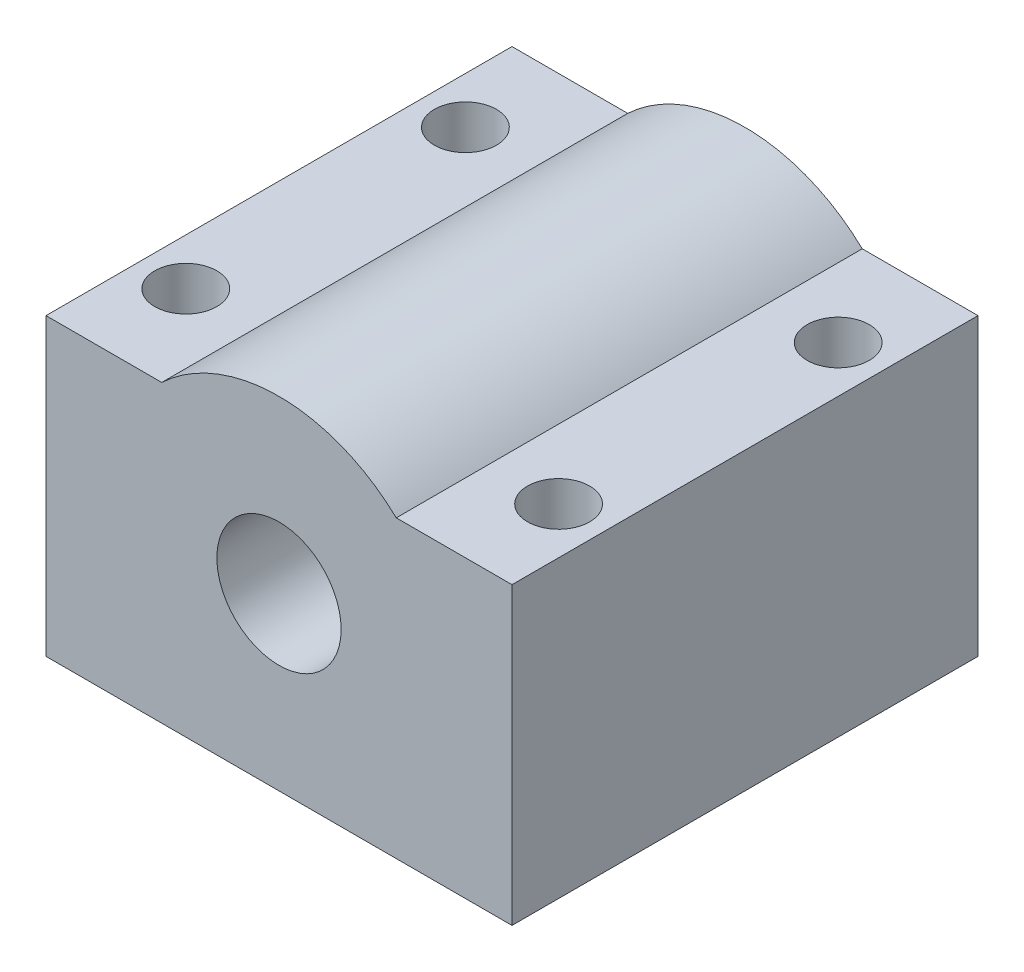
ISO-10303-21;
HEADER;
FILE_DESCRIPTION(('STEP AP214'),'2;1');
FILE_NAME('part.step','',(''),(''),'','','');
FILE_SCHEMA(('AUTOMOTIVE_DESIGN { 1 0 10303 214 1 1 1 1 }'));
ENDSEC;
DATA;
#1=APPLICATION_CONTEXT('core data for automotive mechanical design processes');
#2=APPLICATION_PROTOCOL_DEFINITION('international standard','automotive_design',2000,#1);
#3=PRODUCT_CONTEXT('',#1,'mechanical');
#4=PRODUCT('Part','Part','',(#3));
#5=PRODUCT_RELATED_PRODUCT_CATEGORY('part','',(#4));
#6=PRODUCT_DEFINITION_FORMATION('','',#4);
#7=PRODUCT_DEFINITION_CONTEXT('part definition',#1,'design');
#8=PRODUCT_DEFINITION('design','',#6,#7);
#9=PRODUCT_DEFINITION_SHAPE('','',#8);
#10=(LENGTH_UNIT() NAMED_UNIT(*) SI_UNIT(.MILLI.,.METRE.));
#11=(NAMED_UNIT(*) PLANE_ANGLE_UNIT() SI_UNIT($,.RADIAN.));
#12=(NAMED_UNIT(*) SI_UNIT($,.STERADIAN.) SOLID_ANGLE_UNIT());
#13=UNCERTAINTY_MEASURE_WITH_UNIT(LENGTH_MEASURE(1.E-05),#10,'distance_accuracy_value','');
#14=(GEOMETRIC_REPRESENTATION_CONTEXT(3) GLOBAL_UNCERTAINTY_ASSIGNED_CONTEXT((#13)) GLOBAL_UNIT_ASSIGNED_CONTEXT((#10,
#11,#12)) REPRESENTATION_CONTEXT('',''));
#15=CARTESIAN_POINT('',(0.,0.,0.));
#16=DIRECTION('',(0.,0.,1.));
#17=DIRECTION('',(1.,0.,0.));
#18=AXIS2_PLACEMENT_3D('',#15,#16,#17);
#19=CARTESIAN_POINT('',(0.,0.,30.));
#20=DIRECTION('',(0.,0.,-1.));
#21=DIRECTION('',(-1.,0.,0.));
#22=AXIS2_PLACEMENT_3D('',#19,#20,#21);
#23=CYLINDRICAL_SURFACE('',#22,11.);
#24=DIRECTION('',(0.,0.,-1.));
#25=VECTOR('',#24,1.);
#26=CARTESIAN_POINT('',(-7.54983443527075,8.,30.));
#27=LINE('',#26,#25);
#28=CARTESIAN_POINT('',(-7.54983443527075,8.,30.));
#29=VERTEX_POINT('',#28);
#30=CARTESIAN_POINT('',(-7.54983443527075,8.,0.));
#31=VERTEX_POINT('',#30);
#32=EDGE_CURVE('E90',#29,#31,#27,.T.);
#33=ORIENTED_EDGE('',*,*,#32,.F.);
#34=CARTESIAN_POINT('',(0.,0.,30.));
#35=DIRECTION('',(0.,0.,1.));
#36=DIRECTION('',(1.,0.,0.));
#37=AXIS2_PLACEMENT_3D('',#34,#35,#36);
#38=CIRCLE('',#37,11.);
#39=CARTESIAN_POINT('',(7.54983443527075,8.,30.));
#40=VERTEX_POINT('',#39);
#41=EDGE_CURVE('E11',#40,#29,#38,.T.);
#42=ORIENTED_EDGE('',*,*,#41,.F.);
#43=DIRECTION('',(0.,0.,-1.));
#44=VECTOR('',#43,1.);
#45=CARTESIAN_POINT('',(7.54983443527075,8.,30.));
#46=LINE('',#45,#44);
#47=CARTESIAN_POINT('',(7.54983443527075,8.,0.));
#48=VERTEX_POINT('',#47);
#49=EDGE_CURVE('E53',#40,#48,#46,.T.);
#50=ORIENTED_EDGE('',*,*,#49,.T.);
#51=CARTESIAN_POINT('',(0.,0.,0.));
#52=DIRECTION('',(0.,0.,1.));
#53=DIRECTION('',(1.,0.,0.));
#54=AXIS2_PLACEMENT_3D('',#51,#52,#53);
#55=CIRCLE('',#54,11.);
#56=EDGE_CURVE('E39',#48,#31,#55,.T.);
#57=ORIENTED_EDGE('',*,*,#56,.T.);
#58=EDGE_LOOP('',(#33,#42,#50,#57));
#59=FACE_BOUND('',#58,.T.);
#60=ADVANCED_FACE('F36',(#59),#23,.T.);
#61=CARTESIAN_POINT('',(0.,0.,30.));
#62=DIRECTION('',(0.,0.,1.));
#63=DIRECTION('',(1.,0.,0.));
#64=AXIS2_PLACEMENT_3D('',#61,#62,#63);
#65=PLANE('',#64);
#66=ORIENTED_EDGE('',*,*,#41,.T.);
#67=DIRECTION('',(-1.,0.,0.));
#68=VECTOR('',#67,1.);
#69=CARTESIAN_POINT('',(-15.,8.,30.));
#70=LINE('',#69,#68);
#71=CARTESIAN_POINT('',(-15.,8.,30.));
#72=VERTEX_POINT('',#71);
#73=EDGE_CURVE('E87',#29,#72,#70,.T.);
#74=ORIENTED_EDGE('',*,*,#73,.T.);
#75=DIRECTION('',(0.,1.,0.));
#76=VECTOR('',#75,1.);
#77=CARTESIAN_POINT('',(-15.,-11.,30.));
#78=LINE('',#77,#76);
#79=CARTESIAN_POINT('',(-15.,-11.,30.));
#80=VERTEX_POINT('',#79);
#81=EDGE_CURVE('E128',#80,#72,#78,.T.);
#82=ORIENTED_EDGE('',*,*,#81,.F.);
#83=DIRECTION('',(-1.,0.,0.));
#84=VECTOR('',#83,1.);
#85=CARTESIAN_POINT('',(0.,-11.,30.));
#86=LINE('',#85,#84);
#87=CARTESIAN_POINT('',(15.,-11.,30.));
#88=VERTEX_POINT('',#87);
#89=EDGE_CURVE('E125',#88,#80,#86,.T.);
#90=ORIENTED_EDGE('',*,*,#89,.F.);
#91=DIRECTION('',(0.,1.,0.));
#92=VECTOR('',#91,1.);
#93=CARTESIAN_POINT('',(15.,-11.,30.));
#94=LINE('',#93,#92);
#95=CARTESIAN_POINT('',(15.,8.,30.));
#96=VERTEX_POINT('',#95);
#97=EDGE_CURVE('E105',#88,#96,#94,.T.);
#98=ORIENTED_EDGE('',*,*,#97,.T.);
#99=DIRECTION('',(-1.,0.,0.));
#100=VECTOR('',#99,1.);
#101=CARTESIAN_POINT('',(15.,8.,30.));
#102=LINE('',#101,#100);
#103=EDGE_CURVE('E103',#96,#40,#102,.T.);
#104=ORIENTED_EDGE('',*,*,#103,.T.);
#105=EDGE_LOOP('',(#66,#74,#82,#90,#98,#104));
#106=FACE_BOUND('',#105,.T.);
#107=CARTESIAN_POINT('',(0.,0.,30.));
#108=DIRECTION('',(0.,0.,1.));
#109=DIRECTION('',(1.,0.,0.));
#110=AXIS2_PLACEMENT_3D('',#107,#108,#109);
#111=CIRCLE('',#110,4.);
#112=CARTESIAN_POINT('',(4.,0.,30.));
#113=VERTEX_POINT('',#112);
#114=EDGE_CURVE('E137',#113,#113,#111,.T.);
#115=ORIENTED_EDGE('',*,*,#114,.F.);
#116=EDGE_LOOP('',(#115));
#117=FACE_BOUND('',#116,.T.);
#118=ADVANCED_FACE('F100',(#106,#117),#65,.T.);
#119=CARTESIAN_POINT('',(0.,0.,0.));
#120=DIRECTION('',(0.,0.,1.));
#121=DIRECTION('',(1.,0.,0.));
#122=AXIS2_PLACEMENT_3D('',#119,#120,#121);
#123=PLANE('',#122);
#124=DIRECTION('',(-1.,0.,0.));
#125=VECTOR('',#124,1.);
#126=CARTESIAN_POINT('',(-15.,8.,0.));
#127=LINE('',#126,#125);
#128=CARTESIAN_POINT('',(-15.,8.,0.));
#129=VERTEX_POINT('',#128);
#130=EDGE_CURVE('E96',#31,#129,#127,.T.);
#131=ORIENTED_EDGE('',*,*,#130,.F.);
#132=ORIENTED_EDGE('',*,*,#56,.F.);
#133=DIRECTION('',(-1.,0.,0.));
#134=VECTOR('',#133,1.);
#135=CARTESIAN_POINT('',(15.,8.,0.));
#136=LINE('',#135,#134);
#137=CARTESIAN_POINT('',(15.,8.,0.));
#138=VERTEX_POINT('',#137);
#139=EDGE_CURVE('E98',#138,#48,#136,.T.);
#140=ORIENTED_EDGE('',*,*,#139,.F.);
#141=DIRECTION('',(0.,1.,0.));
#142=VECTOR('',#141,1.);
#143=CARTESIAN_POINT('',(15.,-11.,0.));
#144=LINE('',#143,#142);
#145=CARTESIAN_POINT('',(15.,-11.,0.));
#146=VERTEX_POINT('',#145);
#147=EDGE_CURVE('E115',#146,#138,#144,.T.);
#148=ORIENTED_EDGE('',*,*,#147,.F.);
#149=DIRECTION('',(-1.,0.,0.));
#150=VECTOR('',#149,1.);
#151=CARTESIAN_POINT('',(0.,-11.,0.));
#152=LINE('',#151,#150);
#153=CARTESIAN_POINT('',(-15.,-11.,0.));
#154=VERTEX_POINT('',#153);
#155=EDGE_CURVE('E124',#146,#154,#152,.T.);
#156=ORIENTED_EDGE('',*,*,#155,.T.);
#157=DIRECTION('',(0.,1.,0.));
#158=VECTOR('',#157,1.);
#159=CARTESIAN_POINT('',(-15.,-11.,0.));
#160=LINE('',#159,#158);
#161=EDGE_CURVE('E129',#154,#129,#160,.T.);
#162=ORIENTED_EDGE('',*,*,#161,.T.);
#163=EDGE_LOOP('',(#131,#132,#140,#148,#156,#162));
#164=FACE_BOUND('',#163,.T.);
#165=CARTESIAN_POINT('',(0.,0.,0.));
#166=DIRECTION('',(0.,0.,1.));
#167=DIRECTION('',(1.,0.,0.));
#168=AXIS2_PLACEMENT_3D('',#165,#166,#167);
#169=CIRCLE('',#168,4.);
#170=CARTESIAN_POINT('',(4.,0.,0.));
#171=VERTEX_POINT('',#170);
#172=EDGE_CURVE('E136',#171,#171,#169,.T.);
#173=ORIENTED_EDGE('',*,*,#172,.T.);
#174=EDGE_LOOP('',(#173));
#175=FACE_BOUND('',#174,.T.);
#176=ADVANCED_FACE('F143',(#164,#175),#123,.F.);
#177=CARTESIAN_POINT('',(0.,0.,30.));
#178=DIRECTION('',(0.,0.,-1.));
#179=DIRECTION('',(-1.,0.,0.));
#180=AXIS2_PLACEMENT_3D('',#177,#178,#179);
#181=CYLINDRICAL_SURFACE('',#180,4.);
#182=ORIENTED_EDGE('',*,*,#172,.F.);
#183=EDGE_LOOP('',(#182));
#184=FACE_BOUND('',#183,.T.);
#185=ORIENTED_EDGE('',*,*,#114,.T.);
#186=EDGE_LOOP('',(#185));
#187=FACE_BOUND('',#186,.T.);
#188=ADVANCED_FACE('F145',(#184,#187),#181,.F.);
#189=CARTESIAN_POINT('',(-15.,-11.,30.));
#190=DIRECTION('',(-1.,0.,0.));
#191=DIRECTION('',(0.,0.,1.));
#192=AXIS2_PLACEMENT_3D('',#189,#190,#191);
#193=PLANE('',#192);
#194=ORIENTED_EDGE('',*,*,#161,.F.);
#195=DIRECTION('',(0.,0.,-1.));
#196=VECTOR('',#195,1.);
#197=CARTESIAN_POINT('',(-15.,-11.,30.));
#198=LINE('',#197,#196);
#199=EDGE_CURVE('E131',#80,#154,#198,.T.);
#200=ORIENTED_EDGE('',*,*,#199,.F.);
#201=ORIENTED_EDGE('',*,*,#81,.T.);
#202=DIRECTION('',(0.,0.,-1.));
#203=VECTOR('',#202,1.);
#204=CARTESIAN_POINT('',(-15.,8.,30.));
#205=LINE('',#204,#203);
#206=EDGE_CURVE('E93',#72,#129,#205,.T.);
#207=ORIENTED_EDGE('',*,*,#206,.T.);
#208=EDGE_LOOP('',(#194,#200,#201,#207));
#209=FACE_BOUND('',#208,.T.);
#210=ADVANCED_FACE('F148',(#209),#193,.T.);
#211=CARTESIAN_POINT('',(0.,-11.,30.));
#212=DIRECTION('',(0.,-1.,0.));
#213=DIRECTION('',(0.,0.,-1.));
#214=AXIS2_PLACEMENT_3D('',#211,#212,#213);
#215=PLANE('',#214);
#216=CARTESIAN_POINT('',(-12.,-11.,6.));
#217=DIRECTION('',(0.,-1.,0.));
#218=DIRECTION('',(0.,0.,-1.));
#219=AXIS2_PLACEMENT_3D('',#216,#217,#218);
#220=CIRCLE('',#219,2.);
#221=CARTESIAN_POINT('',(-12.,-11.,4.));
#222=VERTEX_POINT('',#221);
#223=EDGE_CURVE('E215',#222,#222,#220,.T.);
#224=ORIENTED_EDGE('',*,*,#223,.F.);
#225=EDGE_LOOP('',(#224));
#226=FACE_BOUND('',#225,.T.);
#227=CARTESIAN_POINT('',(12.,-11.,6.));
#228=DIRECTION('',(0.,-1.,0.));
#229=DIRECTION('',(0.,0.,-1.));
#230=AXIS2_PLACEMENT_3D('',#227,#228,#229);
#231=CIRCLE('',#230,2.);
#232=CARTESIAN_POINT('',(12.,-11.,4.));
#233=VERTEX_POINT('',#232);
#234=EDGE_CURVE('E209',#233,#233,#231,.T.);
#235=ORIENTED_EDGE('',*,*,#234,.F.);
#236=EDGE_LOOP('',(#235));
#237=FACE_BOUND('',#236,.T.);
#238=CARTESIAN_POINT('',(12.,-11.,24.));
#239=DIRECTION('',(0.,-1.,0.));
#240=DIRECTION('',(0.,0.,-1.));
#241=AXIS2_PLACEMENT_3D('',#238,#239,#240);
#242=CIRCLE('',#241,2.);
#243=CARTESIAN_POINT('',(12.,-11.,22.));
#244=VERTEX_POINT('',#243);
#245=EDGE_CURVE('E196',#244,#244,#242,.T.);
#246=ORIENTED_EDGE('',*,*,#245,.F.);
#247=EDGE_LOOP('',(#246));
#248=FACE_BOUND('',#247,.T.);
#249=CARTESIAN_POINT('',(-12.,-11.,24.));
#250=DIRECTION('',(0.,-1.,0.));
#251=DIRECTION('',(0.,0.,-1.));
#252=AXIS2_PLACEMENT_3D('',#249,#250,#251);
#253=CIRCLE('',#252,2.);
#254=CARTESIAN_POINT('',(-12.,-11.,22.));
#255=VERTEX_POINT('',#254);
#256=EDGE_CURVE('E201',#255,#255,#253,.T.);
#257=ORIENTED_EDGE('',*,*,#256,.F.);
#258=EDGE_LOOP('',(#257));
#259=FACE_BOUND('',#258,.T.);
#260=ORIENTED_EDGE('',*,*,#155,.F.);
#261=DIRECTION('',(0.,0.,-1.));
#262=VECTOR('',#261,1.);
#263=CARTESIAN_POINT('',(15.,-11.,30.));
#264=LINE('',#263,#262);
#265=EDGE_CURVE('E120',#88,#146,#264,.T.);
#266=ORIENTED_EDGE('',*,*,#265,.F.);
#267=ORIENTED_EDGE('',*,*,#89,.T.);
#268=ORIENTED_EDGE('',*,*,#199,.T.);
#269=EDGE_LOOP('',(#260,#266,#267,#268));
#270=FACE_BOUND('',#269,.T.);
#271=ADVANCED_FACE('F159',(#226,#237,#248,#259,#270),#215,.T.);
#272=CARTESIAN_POINT('',(15.,-11.,30.));
#273=DIRECTION('',(-1.,0.,0.));
#274=DIRECTION('',(0.,0.,1.));
#275=AXIS2_PLACEMENT_3D('',#272,#273,#274);
#276=PLANE('',#275);
#277=ORIENTED_EDGE('',*,*,#147,.T.);
#278=DIRECTION('',(0.,0.,-1.));
#279=VECTOR('',#278,1.);
#280=CARTESIAN_POINT('',(15.,8.,30.));
#281=LINE('',#280,#279);
#282=EDGE_CURVE('E113',#96,#138,#281,.T.);
#283=ORIENTED_EDGE('',*,*,#282,.F.);
#284=ORIENTED_EDGE('',*,*,#97,.F.);
#285=ORIENTED_EDGE('',*,*,#265,.T.);
#286=EDGE_LOOP('',(#277,#283,#284,#285));
#287=FACE_BOUND('',#286,.T.);
#288=ADVANCED_FACE('F162',(#287),#276,.F.);
#289=CARTESIAN_POINT('',(15.,8.,30.));
#290=DIRECTION('',(0.,-1.,0.));
#291=DIRECTION('',(1.,0.,0.));
#292=AXIS2_PLACEMENT_3D('',#289,#290,#291);
#293=PLANE('',#292);
#294=CARTESIAN_POINT('',(12.,8.,6.));
#295=DIRECTION('',(0.,-1.,0.));
#296=DIRECTION('',(1.,0.,0.));
#297=AXIS2_PLACEMENT_3D('',#294,#295,#296);
#298=CIRCLE('',#297,2.);
#299=CARTESIAN_POINT('',(14.,8.,6.));
#300=VERTEX_POINT('',#299);
#301=EDGE_CURVE('E206',#300,#300,#298,.F.);
#302=ORIENTED_EDGE('',*,*,#301,.F.);
#303=EDGE_LOOP('',(#302));
#304=FACE_BOUND('',#303,.T.);
#305=CARTESIAN_POINT('',(12.,8.,24.));
#306=DIRECTION('',(0.,-1.,0.));
#307=DIRECTION('',(1.,0.,0.));
#308=AXIS2_PLACEMENT_3D('',#305,#306,#307);
#309=CIRCLE('',#308,2.);
#310=CARTESIAN_POINT('',(14.,8.,24.));
#311=VERTEX_POINT('',#310);
#312=EDGE_CURVE('E199',#311,#311,#309,.F.);
#313=ORIENTED_EDGE('',*,*,#312,.F.);
#314=EDGE_LOOP('',(#313));
#315=FACE_BOUND('',#314,.T.);
#316=ORIENTED_EDGE('',*,*,#139,.T.);
#317=ORIENTED_EDGE('',*,*,#49,.F.);
#318=ORIENTED_EDGE('',*,*,#103,.F.);
#319=ORIENTED_EDGE('',*,*,#282,.T.);
#320=EDGE_LOOP('',(#316,#317,#318,#319));
#321=FACE_BOUND('',#320,.T.);
#322=ADVANCED_FACE('F111',(#304,#315,#321),#293,.F.);
#323=CARTESIAN_POINT('',(-15.,8.,30.));
#324=DIRECTION('',(0.,-1.,0.));
#325=DIRECTION('',(0.,0.,-1.));
#326=AXIS2_PLACEMENT_3D('',#323,#324,#325);
#327=PLANE('',#326);
#328=CARTESIAN_POINT('',(-12.,8.,6.));
#329=DIRECTION('',(0.,-1.,0.));
#330=DIRECTION('',(0.,0.,-1.));
#331=AXIS2_PLACEMENT_3D('',#328,#329,#330);
#332=CIRCLE('',#331,2.);
#333=CARTESIAN_POINT('',(-12.,8.,4.));
#334=VERTEX_POINT('',#333);
#335=EDGE_CURVE('E212',#334,#334,#332,.F.);
#336=ORIENTED_EDGE('',*,*,#335,.F.);
#337=EDGE_LOOP('',(#336));
#338=FACE_BOUND('',#337,.T.);
#339=CARTESIAN_POINT('',(-12.,8.,24.));
#340=DIRECTION('',(0.,-1.,0.));
#341=DIRECTION('',(0.,0.,-1.));
#342=AXIS2_PLACEMENT_3D('',#339,#340,#341);
#343=CIRCLE('',#342,2.);
#344=CARTESIAN_POINT('',(-12.,8.,22.));
#345=VERTEX_POINT('',#344);
#346=EDGE_CURVE('E204',#345,#345,#343,.F.);
#347=ORIENTED_EDGE('',*,*,#346,.F.);
#348=EDGE_LOOP('',(#347));
#349=FACE_BOUND('',#348,.T.);
#350=ORIENTED_EDGE('',*,*,#130,.T.);
#351=ORIENTED_EDGE('',*,*,#206,.F.);
#352=ORIENTED_EDGE('',*,*,#73,.F.);
#353=ORIENTED_EDGE('',*,*,#32,.T.);
#354=EDGE_LOOP('',(#350,#351,#352,#353));
#355=FACE_BOUND('',#354,.T.);
#356=ADVANCED_FACE('F89',(#338,#349,#355),#327,.F.);
#357=CARTESIAN_POINT('',(-12.,11.001,24.));
#358=DIRECTION('',(0.,-1.,0.));
#359=DIRECTION('',(0.,0.,-1.));
#360=AXIS2_PLACEMENT_3D('',#357,#358,#359);
#361=CYLINDRICAL_SURFACE('',#360,2.);
#362=ORIENTED_EDGE('',*,*,#256,.T.);
#363=EDGE_LOOP('',(#362));
#364=FACE_BOUND('',#363,.T.);
#365=ORIENTED_EDGE('',*,*,#346,.T.);
#366=EDGE_LOOP('',(#365));
#367=FACE_BOUND('',#366,.T.);
#368=ADVANCED_FACE('F175',(#364,#367),#361,.F.);
#369=CARTESIAN_POINT('',(-12.,11.001,6.));
#370=DIRECTION('',(0.,-1.,0.));
#371=DIRECTION('',(0.,0.,-1.));
#372=AXIS2_PLACEMENT_3D('',#369,#370,#371);
#373=CYLINDRICAL_SURFACE('',#372,2.);
#374=ORIENTED_EDGE('',*,*,#223,.T.);
#375=EDGE_LOOP('',(#374));
#376=FACE_BOUND('',#375,.T.);
#377=ORIENTED_EDGE('',*,*,#335,.T.);
#378=EDGE_LOOP('',(#377));
#379=FACE_BOUND('',#378,.T.);
#380=ADVANCED_FACE('F179',(#376,#379),#373,.F.);
#381=CARTESIAN_POINT('',(12.,11.001,24.));
#382=DIRECTION('',(0.,-1.,0.));
#383=DIRECTION('',(0.,0.,-1.));
#384=AXIS2_PLACEMENT_3D('',#381,#382,#383);
#385=CYLINDRICAL_SURFACE('',#384,2.);
#386=ORIENTED_EDGE('',*,*,#245,.T.);
#387=EDGE_LOOP('',(#386));
#388=FACE_BOUND('',#387,.T.);
#389=ORIENTED_EDGE('',*,*,#312,.T.);
#390=EDGE_LOOP('',(#389));
#391=FACE_BOUND('',#390,.T.);
#392=ADVANCED_FACE('F183',(#388,#391),#385,.F.);
#393=CARTESIAN_POINT('',(12.,11.001,6.));
#394=DIRECTION('',(0.,-1.,0.));
#395=DIRECTION('',(0.,0.,-1.));
#396=AXIS2_PLACEMENT_3D('',#393,#394,#395);
#397=CYLINDRICAL_SURFACE('',#396,2.);
#398=ORIENTED_EDGE('',*,*,#234,.T.);
#399=EDGE_LOOP('',(#398));
#400=FACE_BOUND('',#399,.T.);
#401=ORIENTED_EDGE('',*,*,#301,.T.);
#402=EDGE_LOOP('',(#401));
#403=FACE_BOUND('',#402,.T.);
#404=ADVANCED_FACE('F185',(#400,#403),#397,.F.);
#405=CLOSED_SHELL('',(#60,#118,#176,#188,#210,#271,#288,#322,#356,#368,#380,#392,#404));
#406=MANIFOLD_SOLID_BREP('B2',#405);
#407=ADVANCED_BREP_SHAPE_REPRESENTATION('',(#18,#406),#14);
#408=SHAPE_DEFINITION_REPRESENTATION(#9,#407);
ENDSEC;
END-ISO-10303-21;
